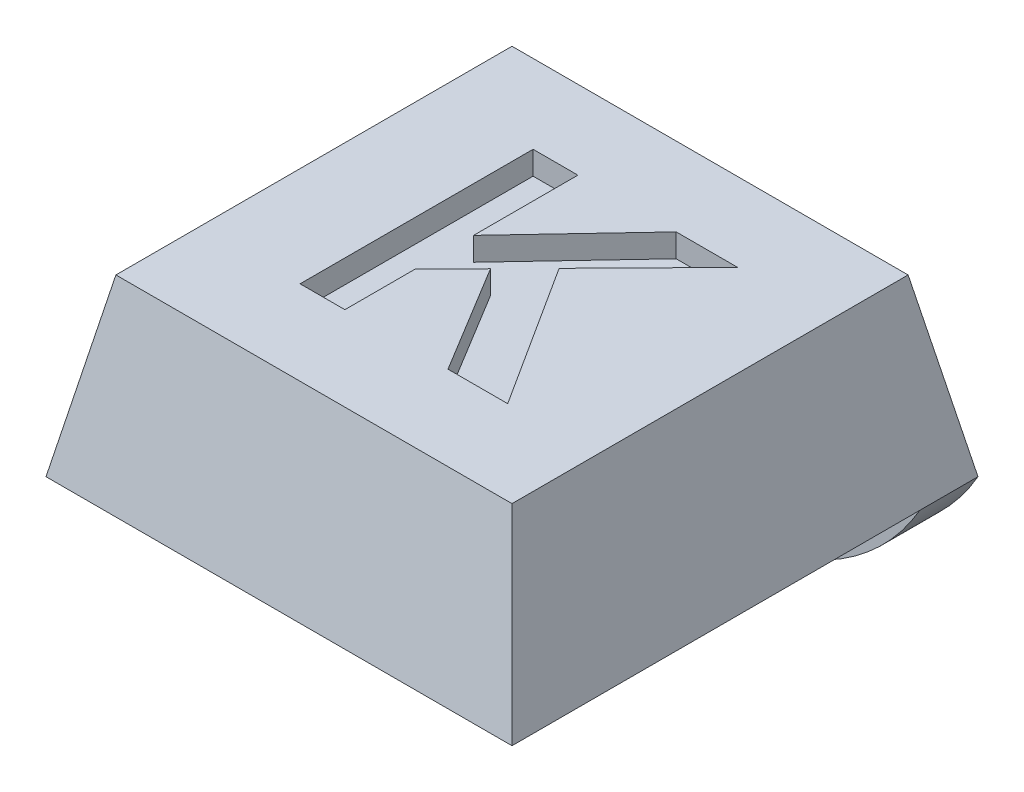
ISO-10303-21;
HEADER;
FILE_DESCRIPTION(('STEP AP214'),'2;1');
FILE_NAME('part.step','',(''),(''),'','','');
FILE_SCHEMA(('AUTOMOTIVE_DESIGN { 1 0 10303 214 1 1 1 1 }'));
ENDSEC;
DATA;
#1=APPLICATION_CONTEXT('core data for automotive mechanical design processes');
#2=APPLICATION_PROTOCOL_DEFINITION('international standard','automotive_design',2000,#1);
#3=PRODUCT_CONTEXT('',#1,'mechanical');
#4=PRODUCT('Part','Part','',(#3));
#5=PRODUCT_RELATED_PRODUCT_CATEGORY('part','',(#4));
#6=PRODUCT_DEFINITION_FORMATION('','',#4);
#7=PRODUCT_DEFINITION_CONTEXT('part definition',#1,'design');
#8=PRODUCT_DEFINITION('design','',#6,#7);
#9=PRODUCT_DEFINITION_SHAPE('','',#8);
#10=(LENGTH_UNIT() NAMED_UNIT(*) SI_UNIT(.MILLI.,.METRE.));
#11=(NAMED_UNIT(*) PLANE_ANGLE_UNIT() SI_UNIT($,.RADIAN.));
#12=(NAMED_UNIT(*) SI_UNIT($,.STERADIAN.) SOLID_ANGLE_UNIT());
#13=UNCERTAINTY_MEASURE_WITH_UNIT(LENGTH_MEASURE(1.E-05),#10,'distance_accuracy_value','');
#14=(GEOMETRIC_REPRESENTATION_CONTEXT(3) GLOBAL_UNCERTAINTY_ASSIGNED_CONTEXT((#13)) GLOBAL_UNIT_ASSIGNED_CONTEXT((#10,
#11,#12)) REPRESENTATION_CONTEXT('',''));
#15=CARTESIAN_POINT('',(0.,0.,0.));
#16=DIRECTION('',(0.,0.,1.));
#17=DIRECTION('',(1.,0.,0.));
#18=AXIS2_PLACEMENT_3D('',#15,#16,#17);
#19=CARTESIAN_POINT('',(0.,3.,0.));
#20=DIRECTION('',(0.,-1.,0.));
#21=DIRECTION('',(0.,0.,-1.));
#22=AXIS2_PLACEMENT_3D('',#19,#20,#21);
#23=PLANE('',#22);
#24=DIRECTION('',(-1.,0.,0.));
#25=VECTOR('',#24,1.);
#26=CARTESIAN_POINT('',(11.,3.,-0.6));
#27=LINE('',#26,#25);
#28=CARTESIAN_POINT('',(7.4,3.,-0.6));
#29=VERTEX_POINT('',#28);
#30=CARTESIAN_POINT('',(0.6,3.,-0.6));
#31=VERTEX_POINT('',#30);
#32=EDGE_CURVE('E230',#29,#31,#27,.T.);
#33=ORIENTED_EDGE('',*,*,#32,.F.);
#34=DIRECTION('',(0.,0.,1.));
#35=VECTOR('',#34,1.);
#36=CARTESIAN_POINT('',(7.4,3.,-8.));
#37=LINE('',#36,#35);
#38=CARTESIAN_POINT('',(7.4,3.,-7.4));
#39=VERTEX_POINT('',#38);
#40=EDGE_CURVE('E243',#39,#29,#37,.T.);
#41=ORIENTED_EDGE('',*,*,#40,.F.);
#42=DIRECTION('',(-1.,0.,0.));
#43=VECTOR('',#42,1.);
#44=CARTESIAN_POINT('',(11.,3.,-7.4));
#45=LINE('',#44,#43);
#46=CARTESIAN_POINT('',(0.599999999999999,3.,-7.4));
#47=VERTEX_POINT('',#46);
#48=EDGE_CURVE('E226',#39,#47,#45,.T.);
#49=ORIENTED_EDGE('',*,*,#48,.T.);
#50=DIRECTION('',(0.,0.,1.));
#51=VECTOR('',#50,1.);
#52=CARTESIAN_POINT('',(0.6,3.,-8.));
#53=LINE('',#52,#51);
#54=EDGE_CURVE('E246',#47,#31,#53,.T.);
#55=ORIENTED_EDGE('',*,*,#54,.T.);
#56=EDGE_LOOP('',(#33,#41,#49,#55));
#57=FACE_BOUND('',#56,.T.);
#58=DIRECTION('',(-1.,0.,0.));
#59=VECTOR('',#58,1.);
#60=CARTESIAN_POINT('',(3.08212967996157,3.,-2.04912159051481));
#61=LINE('',#60,#59);
#62=CARTESIAN_POINT('',(3.08212967996157,3.,-2.04912159051481));
#63=VERTEX_POINT('',#62);
#64=CARTESIAN_POINT('',(2.3128989107308,3.,-2.04912159051481));
#65=VERTEX_POINT('',#64);
#66=EDGE_CURVE('E59',#63,#65,#61,.T.);
#67=ORIENTED_EDGE('',*,*,#66,.T.);
#68=DIRECTION('',(0.,0.,-1.));
#69=VECTOR('',#68,1.);
#70=CARTESIAN_POINT('',(2.3128989107308,3.,-2.04912159051481));
#71=LINE('',#70,#69);
#72=CARTESIAN_POINT('',(2.3128989107308,3.,-6.04912159051481));
#73=VERTEX_POINT('',#72);
#74=EDGE_CURVE('E198',#65,#73,#71,.T.);
#75=ORIENTED_EDGE('',*,*,#74,.T.);
#76=DIRECTION('',(1.,0.,0.));
#77=VECTOR('',#76,1.);
#78=CARTESIAN_POINT('',(2.3128989107308,3.,-6.04912159051481));
#79=LINE('',#78,#77);
#80=CARTESIAN_POINT('',(3.08212967996157,3.,-6.04912159051481));
#81=VERTEX_POINT('',#80);
#82=EDGE_CURVE('E667',#73,#81,#79,.T.);
#83=ORIENTED_EDGE('',*,*,#82,.T.);
#84=DIRECTION('',(0.,0.,1.));
#85=VECTOR('',#84,1.);
#86=CARTESIAN_POINT('',(3.08212967996157,3.,-6.04912159051481));
#87=LINE('',#86,#85);
#88=CARTESIAN_POINT('',(3.08212967996157,3.,-4.25825620589942));
#89=VERTEX_POINT('',#88);
#90=EDGE_CURVE('E669',#81,#89,#87,.T.);
#91=ORIENTED_EDGE('',*,*,#90,.T.);
#92=DIRECTION('',(0.685618651018228,0.,-0.727960895499164));
#93=VECTOR('',#92,1.);
#94=CARTESIAN_POINT('',(3.08212967996157,3.,-4.25825620589942));
#95=LINE('',#94,#93);
#96=CARTESIAN_POINT('',(4.76882839791029,3.,-6.04912159051481));
#97=VERTEX_POINT('',#96);
#98=EDGE_CURVE('E674',#89,#97,#95,.T.);
#99=ORIENTED_EDGE('',*,*,#98,.T.);
#100=DIRECTION('',(1.,0.,0.));
#101=VECTOR('',#100,1.);
#102=CARTESIAN_POINT('',(4.76882839791029,3.,-6.04912159051481));
#103=LINE('',#102,#101);
#104=CARTESIAN_POINT('',(5.82571942355132,3.,-6.04912159051481));
#105=VERTEX_POINT('',#104);
#106=EDGE_CURVE('E684',#97,#105,#103,.T.);
#107=ORIENTED_EDGE('',*,*,#106,.T.);
#108=DIRECTION('',(-0.700795359660879,0.,0.713362365055642));
#109=VECTOR('',#108,1.);
#110=CARTESIAN_POINT('',(5.82571942355132,3.,-6.04912159051481));
#111=LINE('',#110,#109);
#112=CARTESIAN_POINT('',(4.30648865432055,3.,-4.50264723154045));
#113=VERTEX_POINT('',#112);
#114=EDGE_CURVE('E688',#105,#113,#111,.T.);
#115=ORIENTED_EDGE('',*,*,#114,.T.);
#116=DIRECTION('',(0.53911613745139,0.,0.842231435140896));
#117=VECTOR('',#116,1.);
#118=CARTESIAN_POINT('',(4.30648865432055,3.,-4.50264723154045));
#119=LINE('',#118,#117);
#120=CARTESIAN_POINT('',(5.87700147483337,3.,-2.04912159051481));
#121=VERTEX_POINT('',#120);
#122=EDGE_CURVE('E692',#113,#121,#119,.T.);
#123=ORIENTED_EDGE('',*,*,#122,.T.);
#124=DIRECTION('',(-1.,0.,0.));
#125=VECTOR('',#124,1.);
#126=CARTESIAN_POINT('',(5.87700147483337,3.,-2.04912159051481));
#127=LINE('',#126,#125);
#128=CARTESIAN_POINT('',(4.85216173124363,3.,-2.04912159051481));
#129=VERTEX_POINT('',#128);
#130=EDGE_CURVE('E633',#121,#129,#127,.T.);
#131=ORIENTED_EDGE('',*,*,#130,.T.);
#132=DIRECTION('',(-0.519256993232864,0.,-0.854618145711151));
#133=VECTOR('',#132,1.);
#134=CARTESIAN_POINT('',(4.85216173124363,3.,-2.04912159051481));
#135=LINE('',#134,#133);
#136=CARTESIAN_POINT('',(3.72315532098721,3.,-3.90729466743788));
#137=VERTEX_POINT('',#136);
#138=EDGE_CURVE('E628',#129,#137,#135,.T.);
#139=ORIENTED_EDGE('',*,*,#138,.T.);
#140=DIRECTION('',(-0.70094689597696,0.,0.713213466656557));
#141=VECTOR('',#140,1.);
#142=CARTESIAN_POINT('',(3.72315532098721,3.,-3.90729466743788));
#143=LINE('',#142,#141);
#144=CARTESIAN_POINT('',(3.08212967996157,3.,-3.25505107769429));
#145=VERTEX_POINT('',#144);
#146=EDGE_CURVE('E622',#137,#145,#143,.T.);
#147=ORIENTED_EDGE('',*,*,#146,.T.);
#148=DIRECTION('',(0.,0.,1.));
#149=VECTOR('',#148,1.);
#150=CARTESIAN_POINT('',(3.08212967996157,3.,-3.25505107769429));
#151=LINE('',#150,#149);
#152=EDGE_CURVE('E194',#145,#63,#151,.T.);
#153=ORIENTED_EDGE('',*,*,#152,.T.);
#154=EDGE_LOOP('',(#67,#75,#83,#91,#99,#107,#115,#123,#131,#139,#147,#153));
#155=FACE_BOUND('',#154,.T.);
#156=ADVANCED_FACE('F43',(#57,#155),#23,.F.);
#157=CARTESIAN_POINT('',(8.,0.,-8.));
#158=DIRECTION('',(-0.98058067569092,-0.196116135138184,0.));
#159=DIRECTION('',(0.196116135138184,-0.98058067569092,0.));
#160=AXIS2_PLACEMENT_3D('',#157,#158,#159);
#161=PLANE('',#160);
#162=DIRECTION('',(-0.192450089729875,0.962250448649376,-0.192450089729875));
#163=VECTOR('',#162,1.);
#164=CARTESIAN_POINT('',(7.7037037037037,1.48148148148148,-0.296296296296296));
#165=LINE('',#164,#163);
#166=CARTESIAN_POINT('',(8.,0.,0.));
#167=VERTEX_POINT('',#166);
#168=EDGE_CURVE('E240',#167,#29,#165,.T.);
#169=ORIENTED_EDGE('',*,*,#168,.F.);
#170=DIRECTION('',(0.,0.,-1.));
#171=VECTOR('',#170,1.);
#172=CARTESIAN_POINT('',(8.,0.,0.));
#173=LINE('',#172,#171);
#174=CARTESIAN_POINT('',(8.,0.,-7.));
#175=VERTEX_POINT('',#174);
#176=EDGE_CURVE('E259',#167,#175,#173,.T.);
#177=ORIENTED_EDGE('',*,*,#176,.T.);
#178=DIRECTION('',(0.,0.,1.));
#179=VECTOR('',#178,1.);
#180=CARTESIAN_POINT('',(8.,0.,-8.));
#181=LINE('',#180,#179);
#182=CARTESIAN_POINT('',(8.,0.,-8.));
#183=VERTEX_POINT('',#182);
#184=EDGE_CURVE('E200',#183,#175,#181,.T.);
#185=ORIENTED_EDGE('',*,*,#184,.F.);
#186=DIRECTION('',(0.192450089729875,-0.962250448649376,-0.192450089729875));
#187=VECTOR('',#186,1.);
#188=CARTESIAN_POINT('',(8.,0.,-8.));
#189=LINE('',#188,#187);
#190=EDGE_CURVE('E233',#39,#183,#189,.T.);
#191=ORIENTED_EDGE('',*,*,#190,.F.);
#192=ORIENTED_EDGE('',*,*,#40,.T.);
#193=EDGE_LOOP('',(#169,#177,#185,#191,#192));
#194=FACE_BOUND('',#193,.T.);
#195=ADVANCED_FACE('F327',(#194),#161,.F.);
#196=CARTESIAN_POINT('',(0.,0.,-8.));
#197=DIRECTION('',(0.98058067569092,-0.196116135138184,0.));
#198=DIRECTION('',(0.196116135138184,0.98058067569092,0.));
#199=AXIS2_PLACEMENT_3D('',#196,#197,#198);
#200=PLANE('',#199);
#201=DIRECTION('',(-0.192450089729875,-0.962250448649376,0.192450089729875));
#202=VECTOR('',#201,1.);
#203=CARTESIAN_POINT('',(0.296296296296296,1.48148148148148,-0.296296296296296));
#204=LINE('',#203,#202);
#205=CARTESIAN_POINT('',(0.,0.,0.));
#206=VERTEX_POINT('',#205);
#207=EDGE_CURVE('E287',#31,#206,#204,.T.);
#208=ORIENTED_EDGE('',*,*,#207,.F.);
#209=ORIENTED_EDGE('',*,*,#54,.F.);
#210=DIRECTION('',(0.192450089729875,0.962250448649376,0.192450089729875));
#211=VECTOR('',#210,1.);
#212=CARTESIAN_POINT('',(0.,0.,-8.));
#213=LINE('',#212,#211);
#214=CARTESIAN_POINT('',(0.,0.,-8.));
#215=VERTEX_POINT('',#214);
#216=EDGE_CURVE('E258',#215,#47,#213,.T.);
#217=ORIENTED_EDGE('',*,*,#216,.F.);
#218=DIRECTION('',(0.,0.,1.));
#219=VECTOR('',#218,1.);
#220=CARTESIAN_POINT('',(0.,0.,0.));
#221=LINE('',#220,#219);
#222=CARTESIAN_POINT('',(0.,0.,-7.));
#223=VERTEX_POINT('',#222);
#224=EDGE_CURVE('E263',#215,#223,#221,.T.);
#225=ORIENTED_EDGE('',*,*,#224,.T.);
#226=EDGE_CURVE('E250',#223,#206,#221,.T.);
#227=ORIENTED_EDGE('',*,*,#226,.T.);
#228=EDGE_LOOP('',(#208,#209,#217,#225,#227));
#229=FACE_BOUND('',#228,.T.);
#230=ADVANCED_FACE('F311',(#229),#200,.F.);
#231=CARTESIAN_POINT('',(0.,0.,0.));
#232=DIRECTION('',(0.,-1.,0.));
#233=DIRECTION('',(0.,0.,-1.));
#234=AXIS2_PLACEMENT_3D('',#231,#232,#233);
#235=PLANE('',#234);
#236=DIRECTION('',(-1.,0.,0.));
#237=VECTOR('',#236,1.);
#238=CARTESIAN_POINT('',(0.,0.,-7.));
#239=LINE('',#238,#237);
#240=EDGE_CURVE('E206',#175,#223,#239,.T.);
#241=ORIENTED_EDGE('',*,*,#240,.F.);
#242=ORIENTED_EDGE('',*,*,#176,.F.);
#243=DIRECTION('',(1.,0.,0.));
#244=VECTOR('',#243,1.);
#245=CARTESIAN_POINT('',(0.,0.,0.));
#246=LINE('',#245,#244);
#247=EDGE_CURVE('E260',#206,#167,#246,.T.);
#248=ORIENTED_EDGE('',*,*,#247,.F.);
#249=ORIENTED_EDGE('',*,*,#226,.F.);
#250=EDGE_LOOP('',(#241,#242,#248,#249));
#251=FACE_BOUND('',#250,.T.);
#252=CARTESIAN_POINT('',(4.,0.,-3.75));
#253=DIRECTION('',(0.,-1.,0.));
#254=DIRECTION('',(0.,0.,-1.));
#255=AXIS2_PLACEMENT_3D('',#252,#253,#254);
#256=CIRCLE('',#255,1.75);
#257=CARTESIAN_POINT('',(4.,0.,-5.5));
#258=VERTEX_POINT('',#257);
#259=EDGE_CURVE('E218',#258,#258,#256,.T.);
#260=ORIENTED_EDGE('',*,*,#259,.F.);
#261=EDGE_LOOP('',(#260));
#262=FACE_BOUND('',#261,.T.);
#263=ADVANCED_FACE('F322',(#251,#262),#235,.T.);
#264=CARTESIAN_POINT('',(11.,3.,-7.4));
#265=DIRECTION('',(0.,0.196116135138184,-0.98058067569092));
#266=DIRECTION('',(0.,0.98058067569092,0.196116135138184));
#267=AXIS2_PLACEMENT_3D('',#264,#265,#266);
#268=PLANE('',#267);
#269=ORIENTED_EDGE('',*,*,#190,.T.);
#270=DIRECTION('',(-1.,0.,0.));
#271=VECTOR('',#270,1.);
#272=CARTESIAN_POINT('',(0.,0.,-8.));
#273=LINE('',#272,#271);
#274=EDGE_CURVE('E254',#183,#215,#273,.T.);
#275=ORIENTED_EDGE('',*,*,#274,.T.);
#276=ORIENTED_EDGE('',*,*,#216,.T.);
#277=ORIENTED_EDGE('',*,*,#48,.F.);
#278=EDGE_LOOP('',(#269,#275,#276,#277));
#279=FACE_BOUND('',#278,.T.);
#280=ADVANCED_FACE('F306',(#279),#268,.T.);
#281=CARTESIAN_POINT('',(11.,0.,0.));
#282=DIRECTION('',(0.,0.196116135138184,0.98058067569092));
#283=DIRECTION('',(0.,-0.98058067569092,0.196116135138184));
#284=AXIS2_PLACEMENT_3D('',#281,#282,#283);
#285=PLANE('',#284);
#286=ORIENTED_EDGE('',*,*,#168,.T.);
#287=ORIENTED_EDGE('',*,*,#32,.T.);
#288=ORIENTED_EDGE('',*,*,#207,.T.);
#289=ORIENTED_EDGE('',*,*,#247,.T.);
#290=EDGE_LOOP('',(#286,#287,#288,#289));
#291=FACE_BOUND('',#290,.T.);
#292=ADVANCED_FACE('F351',(#291),#285,.T.);
#293=CARTESIAN_POINT('',(4.,0.4,-3.75));
#294=DIRECTION('',(0.,-1.,0.));
#295=DIRECTION('',(0.,0.,-1.));
#296=AXIS2_PLACEMENT_3D('',#293,#294,#295);
#297=CYLINDRICAL_SURFACE('',#296,1.75);
#298=CARTESIAN_POINT('',(4.,0.4,-3.75));
#299=DIRECTION('',(0.,-1.,0.));
#300=DIRECTION('',(0.,0.,-1.));
#301=AXIS2_PLACEMENT_3D('',#298,#299,#300);
#302=CIRCLE('',#301,1.75);
#303=CARTESIAN_POINT('',(4.,0.4,-5.5));
#304=VERTEX_POINT('',#303);
#305=EDGE_CURVE('E222',#304,#304,#302,.T.);
#306=ORIENTED_EDGE('',*,*,#305,.F.);
#307=EDGE_LOOP('',(#306));
#308=FACE_BOUND('',#307,.T.);
#309=ORIENTED_EDGE('',*,*,#259,.T.);
#310=EDGE_LOOP('',(#309));
#311=FACE_BOUND('',#310,.T.);
#312=ADVANCED_FACE('F358',(#308,#311),#297,.F.);
#313=CARTESIAN_POINT('',(4.,0.4,-3.75));
#314=DIRECTION('',(0.,-1.,0.));
#315=DIRECTION('',(0.,0.,-1.));
#316=AXIS2_PLACEMENT_3D('',#313,#314,#315);
#317=PLANE('',#316);
#318=ORIENTED_EDGE('',*,*,#305,.T.);
#319=EDGE_LOOP('',(#318));
#320=FACE_BOUND('',#319,.T.);
#321=ADVANCED_FACE('F362',(#320),#317,.T.);
#322=CARTESIAN_POINT('',(0.,-2.,-8.));
#323=DIRECTION('',(0.,0.,1.));
#324=DIRECTION('',(1.,0.,0.));
#325=AXIS2_PLACEMENT_3D('',#322,#323,#324);
#326=PLANE('',#325);
#327=ORIENTED_EDGE('',*,*,#274,.F.);
#328=CARTESIAN_POINT('',(4.53589838486225,2.,-8.));
#329=DIRECTION('',(0.,0.,1.));
#330=DIRECTION('',(1.,0.,0.));
#331=AXIS2_PLACEMENT_3D('',#328,#329,#330);
#332=CIRCLE('',#331,4.);
#333=CARTESIAN_POINT('',(4.53589838486225,-2.,-8.));
#334=VERTEX_POINT('',#333);
#335=EDGE_CURVE('E11',#183,#334,#332,.F.);
#336=ORIENTED_EDGE('',*,*,#335,.T.);
#337=DIRECTION('',(1.,0.,0.));
#338=VECTOR('',#337,1.);
#339=CARTESIAN_POINT('',(0.,-2.,-8.));
#340=LINE('',#339,#338);
#341=CARTESIAN_POINT('',(3.46410161513775,-2.,-8.));
#342=VERTEX_POINT('',#341);
#343=EDGE_CURVE('E212',#342,#334,#340,.T.);
#344=ORIENTED_EDGE('',*,*,#343,.F.);
#345=CARTESIAN_POINT('',(3.46410161513775,2.,-8.));
#346=DIRECTION('',(0.,0.,1.));
#347=DIRECTION('',(1.,0.,0.));
#348=AXIS2_PLACEMENT_3D('',#345,#346,#347);
#349=CIRCLE('',#348,4.);
#350=EDGE_CURVE('E52',#342,#215,#349,.F.);
#351=ORIENTED_EDGE('',*,*,#350,.T.);
#352=EDGE_LOOP('',(#327,#336,#344,#351));
#353=FACE_BOUND('',#352,.T.);
#354=ADVANCED_FACE('F299',(#353),#326,.F.);
#355=CARTESIAN_POINT('',(0.,-2.,-7.));
#356=DIRECTION('',(0.,0.,-1.));
#357=DIRECTION('',(-1.,0.,0.));
#358=AXIS2_PLACEMENT_3D('',#355,#356,#357);
#359=PLANE('',#358);
#360=DIRECTION('',(-1.,0.,0.));
#361=VECTOR('',#360,1.);
#362=CARTESIAN_POINT('',(0.,-2.,-7.));
#363=LINE('',#362,#361);
#364=CARTESIAN_POINT('',(4.53589838486225,-2.,-7.));
#365=VERTEX_POINT('',#364);
#366=CARTESIAN_POINT('',(3.46410161513775,-2.,-7.));
#367=VERTEX_POINT('',#366);
#368=EDGE_CURVE('E216',#365,#367,#363,.T.);
#369=ORIENTED_EDGE('',*,*,#368,.F.);
#370=CARTESIAN_POINT('',(4.53589838486225,2.,-7.));
#371=DIRECTION('',(0.,0.,-1.));
#372=DIRECTION('',(-1.,0.,0.));
#373=AXIS2_PLACEMENT_3D('',#370,#371,#372);
#374=CIRCLE('',#373,4.);
#375=EDGE_CURVE('E293',#365,#175,#374,.F.);
#376=ORIENTED_EDGE('',*,*,#375,.T.);
#377=ORIENTED_EDGE('',*,*,#240,.T.);
#378=CARTESIAN_POINT('',(3.46410161513775,2.,-7.));
#379=DIRECTION('',(0.,0.,-1.));
#380=DIRECTION('',(-1.,0.,0.));
#381=AXIS2_PLACEMENT_3D('',#378,#379,#380);
#382=CIRCLE('',#381,4.);
#383=EDGE_CURVE('E67',#223,#367,#382,.F.);
#384=ORIENTED_EDGE('',*,*,#383,.T.);
#385=EDGE_LOOP('',(#369,#376,#377,#384));
#386=FACE_BOUND('',#385,.T.);
#387=ADVANCED_FACE('F317',(#386),#359,.F.);
#388=CARTESIAN_POINT('',(0.,-2.,0.));
#389=DIRECTION('',(0.,1.,0.));
#390=DIRECTION('',(0.,0.,1.));
#391=AXIS2_PLACEMENT_3D('',#388,#389,#390);
#392=PLANE('',#391);
#393=ORIENTED_EDGE('',*,*,#343,.T.);
#394=DIRECTION('',(0.,0.,1.));
#395=VECTOR('',#394,1.);
#396=CARTESIAN_POINT('',(4.53589838486225,-2.,0.));
#397=LINE('',#396,#395);
#398=EDGE_CURVE('E286',#334,#365,#397,.T.);
#399=ORIENTED_EDGE('',*,*,#398,.T.);
#400=ORIENTED_EDGE('',*,*,#368,.T.);
#401=DIRECTION('',(0.,0.,-1.));
#402=VECTOR('',#401,1.);
#403=CARTESIAN_POINT('',(3.46410161513775,-2.,0.));
#404=LINE('',#403,#402);
#405=EDGE_CURVE('E282',#367,#342,#404,.T.);
#406=ORIENTED_EDGE('',*,*,#405,.T.);
#407=EDGE_LOOP('',(#393,#399,#400,#406));
#408=FACE_BOUND('',#407,.T.);
#409=ADVANCED_FACE('F315',(#408),#392,.F.);
#410=CARTESIAN_POINT('',(4.53589838486225,2.,-8.));
#411=DIRECTION('',(0.,0.,1.));
#412=DIRECTION('',(1.,0.,0.));
#413=AXIS2_PLACEMENT_3D('',#410,#411,#412);
#414=CYLINDRICAL_SURFACE('',#413,4.);
#415=ORIENTED_EDGE('',*,*,#335,.F.);
#416=ORIENTED_EDGE('',*,*,#184,.T.);
#417=ORIENTED_EDGE('',*,*,#375,.F.);
#418=ORIENTED_EDGE('',*,*,#398,.F.);
#419=EDGE_LOOP('',(#415,#416,#417,#418));
#420=FACE_BOUND('',#419,.T.);
#421=ADVANCED_FACE('F328',(#420),#414,.T.);
#422=CARTESIAN_POINT('',(3.46410161513775,2.,-8.));
#423=DIRECTION('',(0.,0.,-1.));
#424=DIRECTION('',(-1.,0.,0.));
#425=AXIS2_PLACEMENT_3D('',#422,#423,#424);
#426=CYLINDRICAL_SURFACE('',#425,4.);
#427=ORIENTED_EDGE('',*,*,#383,.F.);
#428=ORIENTED_EDGE('',*,*,#224,.F.);
#429=ORIENTED_EDGE('',*,*,#350,.F.);
#430=ORIENTED_EDGE('',*,*,#405,.F.);
#431=EDGE_LOOP('',(#427,#428,#429,#430));
#432=FACE_BOUND('',#431,.T.);
#433=ADVANCED_FACE('F45',(#432),#426,.T.);
#434=CARTESIAN_POINT('',(3.08212967996157,2.6,-2.04912159051481));
#435=DIRECTION('',(0.,0.,-1.));
#436=DIRECTION('',(-1.,0.,0.));
#437=AXIS2_PLACEMENT_3D('',#434,#435,#436);
#438=PLANE('',#437);
#439=ORIENTED_EDGE('',*,*,#66,.F.);
#440=DIRECTION('',(0.,1.,0.));
#441=VECTOR('',#440,1.);
#442=CARTESIAN_POINT('',(3.08212967996157,2.6,-2.04912159051481));
#443=LINE('',#442,#441);
#444=CARTESIAN_POINT('',(3.08212967996157,2.6,-2.04912159051481));
#445=VERTEX_POINT('',#444);
#446=EDGE_CURVE('E192',#445,#63,#443,.T.);
#447=ORIENTED_EDGE('',*,*,#446,.F.);
#448=DIRECTION('',(-1.,0.,0.));
#449=VECTOR('',#448,1.);
#450=CARTESIAN_POINT('',(3.08212967996157,2.6,-2.04912159051481));
#451=LINE('',#450,#449);
#452=CARTESIAN_POINT('',(2.3128989107308,2.6,-2.04912159051481));
#453=VERTEX_POINT('',#452);
#454=EDGE_CURVE('E182',#445,#453,#451,.T.);
#455=ORIENTED_EDGE('',*,*,#454,.T.);
#456=DIRECTION('',(0.,1.,0.));
#457=VECTOR('',#456,1.);
#458=CARTESIAN_POINT('',(2.3128989107308,2.6,-2.04912159051481));
#459=LINE('',#458,#457);
#460=EDGE_CURVE('E191',#453,#65,#459,.T.);
#461=ORIENTED_EDGE('',*,*,#460,.T.);
#462=EDGE_LOOP('',(#439,#447,#455,#461));
#463=FACE_BOUND('',#462,.T.);
#464=ADVANCED_FACE('F190',(#463),#438,.T.);
#465=CARTESIAN_POINT('',(2.3128989107308,2.6,-2.04912159051481));
#466=DIRECTION('',(1.,0.,0.));
#467=DIRECTION('',(0.,0.,-1.));
#468=AXIS2_PLACEMENT_3D('',#465,#466,#467);
#469=PLANE('',#468);
#470=ORIENTED_EDGE('',*,*,#74,.F.);
#471=ORIENTED_EDGE('',*,*,#460,.F.);
#472=DIRECTION('',(0.,0.,-1.));
#473=VECTOR('',#472,1.);
#474=CARTESIAN_POINT('',(2.3128989107308,2.6,-2.04912159051481));
#475=LINE('',#474,#473);
#476=CARTESIAN_POINT('',(2.3128989107308,2.6,-6.04912159051481));
#477=VERTEX_POINT('',#476);
#478=EDGE_CURVE('E178',#453,#477,#475,.T.);
#479=ORIENTED_EDGE('',*,*,#478,.T.);
#480=DIRECTION('',(0.,1.,0.));
#481=VECTOR('',#480,1.);
#482=CARTESIAN_POINT('',(2.3128989107308,2.6,-6.04912159051481));
#483=LINE('',#482,#481);
#484=EDGE_CURVE('E201',#477,#73,#483,.T.);
#485=ORIENTED_EDGE('',*,*,#484,.T.);
#486=EDGE_LOOP('',(#470,#471,#479,#485));
#487=FACE_BOUND('',#486,.T.);
#488=ADVANCED_FACE('F196',(#487),#469,.T.);
#489=CARTESIAN_POINT('',(2.3128989107308,2.6,-6.04912159051481));
#490=DIRECTION('',(0.,0.,1.));
#491=DIRECTION('',(1.,0.,0.));
#492=AXIS2_PLACEMENT_3D('',#489,#490,#491);
#493=PLANE('',#492);
#494=ORIENTED_EDGE('',*,*,#82,.F.);
#495=ORIENTED_EDGE('',*,*,#484,.F.);
#496=DIRECTION('',(1.,0.,0.));
#497=VECTOR('',#496,1.);
#498=CARTESIAN_POINT('',(2.3128989107308,2.6,-6.04912159051481));
#499=LINE('',#498,#497);
#500=CARTESIAN_POINT('',(3.08212967996157,2.6,-6.04912159051481));
#501=VERTEX_POINT('',#500);
#502=EDGE_CURVE('E184',#477,#501,#499,.T.);
#503=ORIENTED_EDGE('',*,*,#502,.T.);
#504=DIRECTION('',(0.,1.,0.));
#505=VECTOR('',#504,1.);
#506=CARTESIAN_POINT('',(3.08212967996157,2.6,-6.04912159051481));
#507=LINE('',#506,#505);
#508=EDGE_CURVE('E208',#501,#81,#507,.T.);
#509=ORIENTED_EDGE('',*,*,#508,.T.);
#510=EDGE_LOOP('',(#494,#495,#503,#509));
#511=FACE_BOUND('',#510,.T.);
#512=ADVANCED_FACE('F375',(#511),#493,.T.);
#513=CARTESIAN_POINT('',(3.08212967996157,2.6,-6.04912159051481));
#514=DIRECTION('',(-1.,0.,0.));
#515=DIRECTION('',(0.,0.,1.));
#516=AXIS2_PLACEMENT_3D('',#513,#514,#515);
#517=PLANE('',#516);
#518=ORIENTED_EDGE('',*,*,#90,.F.);
#519=ORIENTED_EDGE('',*,*,#508,.F.);
#520=DIRECTION('',(0.,0.,1.));
#521=VECTOR('',#520,1.);
#522=CARTESIAN_POINT('',(3.08212967996157,2.6,-6.04912159051481));
#523=LINE('',#522,#521);
#524=CARTESIAN_POINT('',(3.08212967996157,2.6,-4.25825620589942));
#525=VERTEX_POINT('',#524);
#526=EDGE_CURVE('E728',#501,#525,#523,.T.);
#527=ORIENTED_EDGE('',*,*,#526,.T.);
#528=DIRECTION('',(0.,1.,0.));
#529=VECTOR('',#528,1.);
#530=CARTESIAN_POINT('',(3.08212967996157,2.6,-4.25825620589942));
#531=LINE('',#530,#529);
#532=EDGE_CURVE('E660',#525,#89,#531,.T.);
#533=ORIENTED_EDGE('',*,*,#532,.T.);
#534=EDGE_LOOP('',(#518,#519,#527,#533));
#535=FACE_BOUND('',#534,.T.);
#536=ADVANCED_FACE('F378',(#535),#517,.T.);
#537=CARTESIAN_POINT('',(3.08212967996157,2.6,-4.25825620589942));
#538=DIRECTION('',(0.727960895499164,0.,0.685618651018228));
#539=DIRECTION('',(0.685618651018228,0.,-0.727960895499164));
#540=AXIS2_PLACEMENT_3D('',#537,#538,#539);
#541=PLANE('',#540);
#542=ORIENTED_EDGE('',*,*,#98,.F.);
#543=ORIENTED_EDGE('',*,*,#532,.F.);
#544=DIRECTION('',(0.685618651018228,0.,-0.727960895499164));
#545=VECTOR('',#544,1.);
#546=CARTESIAN_POINT('',(3.08212967996157,2.6,-4.25825620589942));
#547=LINE('',#546,#545);
#548=CARTESIAN_POINT('',(4.76882839791029,2.6,-6.04912159051481));
#549=VERTEX_POINT('',#548);
#550=EDGE_CURVE('E725',#525,#549,#547,.T.);
#551=ORIENTED_EDGE('',*,*,#550,.T.);
#552=DIRECTION('',(0.,1.,0.));
#553=VECTOR('',#552,1.);
#554=CARTESIAN_POINT('',(4.76882839791029,2.6,-6.04912159051481));
#555=LINE('',#554,#553);
#556=EDGE_CURVE('E657',#549,#97,#555,.T.);
#557=ORIENTED_EDGE('',*,*,#556,.T.);
#558=EDGE_LOOP('',(#542,#543,#551,#557));
#559=FACE_BOUND('',#558,.T.);
#560=ADVANCED_FACE('F382',(#559),#541,.T.);
#561=CARTESIAN_POINT('',(4.76882839791029,2.6,-6.04912159051481));
#562=DIRECTION('',(0.,0.,1.));
#563=DIRECTION('',(1.,0.,0.));
#564=AXIS2_PLACEMENT_3D('',#561,#562,#563);
#565=PLANE('',#564);
#566=ORIENTED_EDGE('',*,*,#106,.F.);
#567=ORIENTED_EDGE('',*,*,#556,.F.);
#568=DIRECTION('',(1.,0.,0.));
#569=VECTOR('',#568,1.);
#570=CARTESIAN_POINT('',(4.76882839791029,2.6,-6.04912159051481));
#571=LINE('',#570,#569);
#572=CARTESIAN_POINT('',(5.82571942355132,2.6,-6.04912159051481));
#573=VERTEX_POINT('',#572);
#574=EDGE_CURVE('E722',#549,#573,#571,.T.);
#575=ORIENTED_EDGE('',*,*,#574,.T.);
#576=DIRECTION('',(0.,1.,0.));
#577=VECTOR('',#576,1.);
#578=CARTESIAN_POINT('',(5.82571942355132,2.6,-6.04912159051481));
#579=LINE('',#578,#577);
#580=EDGE_CURVE('E654',#573,#105,#579,.T.);
#581=ORIENTED_EDGE('',*,*,#580,.T.);
#582=EDGE_LOOP('',(#566,#567,#575,#581));
#583=FACE_BOUND('',#582,.T.);
#584=ADVANCED_FACE('F386',(#583),#565,.T.);
#585=CARTESIAN_POINT('',(5.82571942355132,2.6,-6.04912159051481));
#586=DIRECTION('',(-0.713362365055642,0.,-0.700795359660879));
#587=DIRECTION('',(-0.700795359660879,0.,0.713362365055642));
#588=AXIS2_PLACEMENT_3D('',#585,#586,#587);
#589=PLANE('',#588);
#590=ORIENTED_EDGE('',*,*,#114,.F.);
#591=ORIENTED_EDGE('',*,*,#580,.F.);
#592=DIRECTION('',(-0.700795359660879,0.,0.713362365055642));
#593=VECTOR('',#592,1.);
#594=CARTESIAN_POINT('',(5.82571942355132,2.6,-6.04912159051481));
#595=LINE('',#594,#593);
#596=CARTESIAN_POINT('',(4.30648865432055,2.6,-4.50264723154045));
#597=VERTEX_POINT('',#596);
#598=EDGE_CURVE('E719',#573,#597,#595,.T.);
#599=ORIENTED_EDGE('',*,*,#598,.T.);
#600=DIRECTION('',(0.,1.,0.));
#601=VECTOR('',#600,1.);
#602=CARTESIAN_POINT('',(4.30648865432055,2.6,-4.50264723154045));
#603=LINE('',#602,#601);
#604=EDGE_CURVE('E651',#597,#113,#603,.T.);
#605=ORIENTED_EDGE('',*,*,#604,.T.);
#606=EDGE_LOOP('',(#590,#591,#599,#605));
#607=FACE_BOUND('',#606,.T.);
#608=ADVANCED_FACE('F390',(#607),#589,.T.);
#609=CARTESIAN_POINT('',(4.30648865432055,2.6,-4.50264723154045));
#610=DIRECTION('',(-0.842231435140896,0.,0.53911613745139));
#611=DIRECTION('',(0.53911613745139,0.,0.842231435140896));
#612=AXIS2_PLACEMENT_3D('',#609,#610,#611);
#613=PLANE('',#612);
#614=ORIENTED_EDGE('',*,*,#122,.F.);
#615=ORIENTED_EDGE('',*,*,#604,.F.);
#616=DIRECTION('',(0.53911613745139,0.,0.842231435140896));
#617=VECTOR('',#616,1.);
#618=CARTESIAN_POINT('',(4.30648865432055,2.6,-4.50264723154045));
#619=LINE('',#618,#617);
#620=CARTESIAN_POINT('',(5.87700147483337,2.6,-2.04912159051481));
#621=VERTEX_POINT('',#620);
#622=EDGE_CURVE('E716',#597,#621,#619,.T.);
#623=ORIENTED_EDGE('',*,*,#622,.T.);
#624=DIRECTION('',(0.,1.,0.));
#625=VECTOR('',#624,1.);
#626=CARTESIAN_POINT('',(5.87700147483337,2.6,-2.04912159051481));
#627=LINE('',#626,#625);
#628=EDGE_CURVE('E648',#621,#121,#627,.T.);
#629=ORIENTED_EDGE('',*,*,#628,.T.);
#630=EDGE_LOOP('',(#614,#615,#623,#629));
#631=FACE_BOUND('',#630,.T.);
#632=ADVANCED_FACE('F394',(#631),#613,.T.);
#633=CARTESIAN_POINT('',(5.87700147483337,2.6,-2.04912159051481));
#634=DIRECTION('',(0.,0.,-1.));
#635=DIRECTION('',(-1.,0.,0.));
#636=AXIS2_PLACEMENT_3D('',#633,#634,#635);
#637=PLANE('',#636);
#638=ORIENTED_EDGE('',*,*,#130,.F.);
#639=ORIENTED_EDGE('',*,*,#628,.F.);
#640=DIRECTION('',(-1.,0.,0.));
#641=VECTOR('',#640,1.);
#642=CARTESIAN_POINT('',(5.87700147483337,2.6,-2.04912159051481));
#643=LINE('',#642,#641);
#644=CARTESIAN_POINT('',(4.85216173124363,2.6,-2.04912159051481));
#645=VERTEX_POINT('',#644);
#646=EDGE_CURVE('E701',#621,#645,#643,.T.);
#647=ORIENTED_EDGE('',*,*,#646,.T.);
#648=DIRECTION('',(0.,1.,0.));
#649=VECTOR('',#648,1.);
#650=CARTESIAN_POINT('',(4.85216173124363,2.6,-2.04912159051481));
#651=LINE('',#650,#649);
#652=EDGE_CURVE('E645',#645,#129,#651,.T.);
#653=ORIENTED_EDGE('',*,*,#652,.T.);
#654=EDGE_LOOP('',(#638,#639,#647,#653));
#655=FACE_BOUND('',#654,.T.);
#656=ADVANCED_FACE('F398',(#655),#637,.T.);
#657=CARTESIAN_POINT('',(4.85216173124363,2.6,-2.04912159051481));
#658=DIRECTION('',(0.854618145711151,0.,-0.519256993232864));
#659=DIRECTION('',(-0.519256993232864,0.,-0.854618145711151));
#660=AXIS2_PLACEMENT_3D('',#657,#658,#659);
#661=PLANE('',#660);
#662=ORIENTED_EDGE('',*,*,#138,.F.);
#663=ORIENTED_EDGE('',*,*,#652,.F.);
#664=DIRECTION('',(-0.519256993232864,0.,-0.854618145711151));
#665=VECTOR('',#664,1.);
#666=CARTESIAN_POINT('',(4.85216173124363,2.6,-2.04912159051481));
#667=LINE('',#666,#665);
#668=CARTESIAN_POINT('',(3.72315532098721,2.6,-3.90729466743788));
#669=VERTEX_POINT('',#668);
#670=EDGE_CURVE('E703',#645,#669,#667,.T.);
#671=ORIENTED_EDGE('',*,*,#670,.T.);
#672=DIRECTION('',(0.,1.,0.));
#673=VECTOR('',#672,1.);
#674=CARTESIAN_POINT('',(3.72315532098721,2.6,-3.90729466743788));
#675=LINE('',#674,#673);
#676=EDGE_CURVE('E642',#669,#137,#675,.T.);
#677=ORIENTED_EDGE('',*,*,#676,.T.);
#678=EDGE_LOOP('',(#662,#663,#671,#677));
#679=FACE_BOUND('',#678,.T.);
#680=ADVANCED_FACE('F402',(#679),#661,.T.);
#681=CARTESIAN_POINT('',(3.72315532098721,2.6,-3.90729466743788));
#682=DIRECTION('',(-0.713213466656557,0.,-0.70094689597696));
#683=DIRECTION('',(-0.70094689597696,0.,0.713213466656557));
#684=AXIS2_PLACEMENT_3D('',#681,#682,#683);
#685=PLANE('',#684);
#686=ORIENTED_EDGE('',*,*,#146,.F.);
#687=ORIENTED_EDGE('',*,*,#676,.F.);
#688=DIRECTION('',(-0.70094689597696,0.,0.713213466656557));
#689=VECTOR('',#688,1.);
#690=CARTESIAN_POINT('',(3.72315532098721,2.6,-3.90729466743788));
#691=LINE('',#690,#689);
#692=CARTESIAN_POINT('',(3.08212967996157,2.6,-3.25505107769429));
#693=VERTEX_POINT('',#692);
#694=EDGE_CURVE('E705',#669,#693,#691,.T.);
#695=ORIENTED_EDGE('',*,*,#694,.T.);
#696=DIRECTION('',(0.,1.,0.));
#697=VECTOR('',#696,1.);
#698=CARTESIAN_POINT('',(3.08212967996157,2.6,-3.25505107769429));
#699=LINE('',#698,#697);
#700=EDGE_CURVE('E620',#693,#145,#699,.T.);
#701=ORIENTED_EDGE('',*,*,#700,.T.);
#702=EDGE_LOOP('',(#686,#687,#695,#701));
#703=FACE_BOUND('',#702,.T.);
#704=ADVANCED_FACE('F406',(#703),#685,.T.);
#705=CARTESIAN_POINT('',(3.08212967996157,2.6,-3.25505107769429));
#706=DIRECTION('',(-1.,0.,0.));
#707=DIRECTION('',(0.,0.,1.));
#708=AXIS2_PLACEMENT_3D('',#705,#706,#707);
#709=PLANE('',#708);
#710=ORIENTED_EDGE('',*,*,#152,.F.);
#711=ORIENTED_EDGE('',*,*,#700,.F.);
#712=DIRECTION('',(0.,0.,1.));
#713=VECTOR('',#712,1.);
#714=CARTESIAN_POINT('',(3.08212967996157,2.6,-3.25505107769429));
#715=LINE('',#714,#713);
#716=EDGE_CURVE('E639',#693,#445,#715,.T.);
#717=ORIENTED_EDGE('',*,*,#716,.T.);
#718=ORIENTED_EDGE('',*,*,#446,.T.);
#719=EDGE_LOOP('',(#710,#711,#717,#718));
#720=FACE_BOUND('',#719,.T.);
#721=ADVANCED_FACE('F410',(#720),#709,.T.);
#722=CARTESIAN_POINT('',(0.,2.6,0.));
#723=DIRECTION('',(0.,-1.,0.));
#724=DIRECTION('',(0.,0.,-1.));
#725=AXIS2_PLACEMENT_3D('',#722,#723,#724);
#726=PLANE('',#725);
#727=ORIENTED_EDGE('',*,*,#454,.F.);
#728=ORIENTED_EDGE('',*,*,#716,.F.);
#729=ORIENTED_EDGE('',*,*,#694,.F.);
#730=ORIENTED_EDGE('',*,*,#670,.F.);
#731=ORIENTED_EDGE('',*,*,#646,.F.);
#732=ORIENTED_EDGE('',*,*,#622,.F.);
#733=ORIENTED_EDGE('',*,*,#598,.F.);
#734=ORIENTED_EDGE('',*,*,#574,.F.);
#735=ORIENTED_EDGE('',*,*,#550,.F.);
#736=ORIENTED_EDGE('',*,*,#526,.F.);
#737=ORIENTED_EDGE('',*,*,#502,.F.);
#738=ORIENTED_EDGE('',*,*,#478,.F.);
#739=EDGE_LOOP('',(#727,#728,#729,#730,#731,#732,#733,#734,#735,#736,#737,#738));
#740=FACE_BOUND('',#739,.T.);
#741=ADVANCED_FACE('F180',(#740),#726,.F.);
#742=CLOSED_SHELL('',(#156,#195,#230,#263,#280,#292,#312,#321,#354,#387,#409,#421,#433,#464,
#488,#512,#536,#560,#584,#608,#632,#656,#680,#704,#721,#741));
#743=MANIFOLD_SOLID_BREP('B2',#742);
#744=ADVANCED_BREP_SHAPE_REPRESENTATION('',(#18,#743),#14);
#745=SHAPE_DEFINITION_REPRESENTATION(#9,#744);
ENDSEC;
END-ISO-10303-21;
